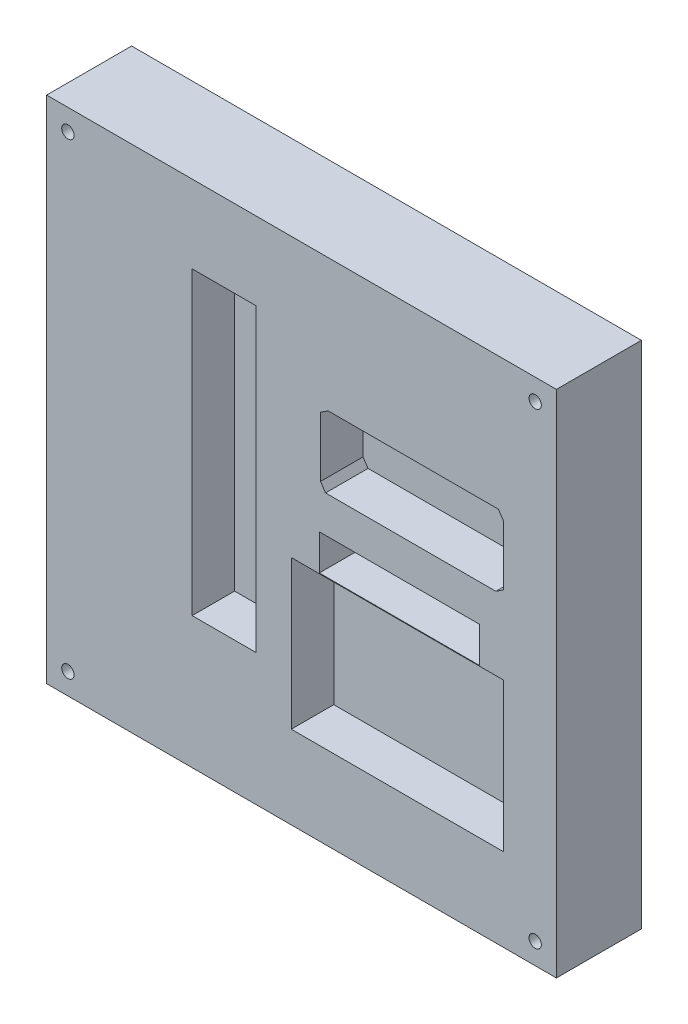
ISO-10303-21;
HEADER;
FILE_DESCRIPTION(('STEP AP214'),'2;1');
FILE_NAME('part.step','',(''),(''),'','','');
FILE_SCHEMA(('AUTOMOTIVE_DESIGN { 1 0 10303 214 1 1 1 1 }'));
ENDSEC;
DATA;
#1=APPLICATION_CONTEXT('core data for automotive mechanical design processes');
#2=APPLICATION_PROTOCOL_DEFINITION('international standard','automotive_design',2000,#1);
#3=PRODUCT_CONTEXT('',#1,'mechanical');
#4=PRODUCT('Part','Part','',(#3));
#5=PRODUCT_RELATED_PRODUCT_CATEGORY('part','',(#4));
#6=PRODUCT_DEFINITION_FORMATION('','',#4);
#7=PRODUCT_DEFINITION_CONTEXT('part definition',#1,'design');
#8=PRODUCT_DEFINITION('design','',#6,#7);
#9=PRODUCT_DEFINITION_SHAPE('','',#8);
#10=(LENGTH_UNIT() NAMED_UNIT(*) SI_UNIT(.MILLI.,.METRE.));
#11=(NAMED_UNIT(*) PLANE_ANGLE_UNIT() SI_UNIT($,.RADIAN.));
#12=(NAMED_UNIT(*) SI_UNIT($,.STERADIAN.) SOLID_ANGLE_UNIT());
#13=UNCERTAINTY_MEASURE_WITH_UNIT(LENGTH_MEASURE(1.E-05),#10,'distance_accuracy_value','');
#14=(GEOMETRIC_REPRESENTATION_CONTEXT(3) GLOBAL_UNCERTAINTY_ASSIGNED_CONTEXT((#13)) GLOBAL_UNIT_ASSIGNED_CONTEXT((#10,
#11,#12)) REPRESENTATION_CONTEXT('',''));
#15=CARTESIAN_POINT('',(0.,0.,0.));
#16=DIRECTION('',(0.,0.,1.));
#17=DIRECTION('',(1.,0.,0.));
#18=AXIS2_PLACEMENT_3D('',#15,#16,#17);
#19=CARTESIAN_POINT('',(-55.,55.,10.));
#20=DIRECTION('',(0.,0.,-1.));
#21=DIRECTION('',(-1.,0.,0.));
#22=AXIS2_PLACEMENT_3D('',#19,#20,#21);
#23=CYLINDRICAL_SURFACE('',#22,1.45);
#24=CARTESIAN_POINT('',(-55.,55.,3.));
#25=DIRECTION('',(0.,0.,1.));
#26=DIRECTION('',(1.,0.,0.));
#27=AXIS2_PLACEMENT_3D('',#24,#25,#26);
#28=CIRCLE('',#27,1.45);
#29=CARTESIAN_POINT('',(-53.55,55.,3.));
#30=VERTEX_POINT('',#29);
#31=EDGE_CURVE('E12',#30,#30,#28,.F.);
#32=ORIENTED_EDGE('',*,*,#31,.T.);
#33=EDGE_LOOP('',(#32));
#34=FACE_BOUND('',#33,.T.);
#35=CARTESIAN_POINT('',(-54.9999999999998,55.0000000000002,20.));
#36=DIRECTION('',(0.,0.,1.));
#37=DIRECTION('',(1.,0.,0.));
#38=AXIS2_PLACEMENT_3D('',#35,#36,#37);
#39=CIRCLE('',#38,1.45);
#40=CARTESIAN_POINT('',(-53.5499999999998,55.0000000000002,20.));
#41=VERTEX_POINT('',#40);
#42=EDGE_CURVE('E414',#41,#41,#39,.T.);
#43=ORIENTED_EDGE('',*,*,#42,.T.);
#44=EDGE_LOOP('',(#43));
#45=FACE_BOUND('',#44,.T.);
#46=ADVANCED_FACE('F193',(#34,#45),#23,.F.);
#47=CARTESIAN_POINT('',(0.,0.,3.));
#48=DIRECTION('',(0.,0.,1.));
#49=DIRECTION('',(1.,0.,0.));
#50=AXIS2_PLACEMENT_3D('',#47,#48,#49);
#51=PLANE('',#50);
#52=ORIENTED_EDGE('',*,*,#31,.F.);
#53=EDGE_LOOP('',(#52));
#54=FACE_BOUND('',#53,.T.);
#55=ADVANCED_FACE('F752',(#54),#51,.T.);
#56=CARTESIAN_POINT('',(0.,0.,10.));
#57=DIRECTION('',(0.,0.,1.));
#58=DIRECTION('',(1.,0.,0.));
#59=AXIS2_PLACEMENT_3D('',#56,#57,#58);
#60=PLANE('',#59);
#61=DIRECTION('',(0.,1.,0.));
#62=VECTOR('',#61,1.);
#63=CARTESIAN_POINT('',(4.18960599997163,0.,10.));
#64=LINE('',#63,#62);
#65=CARTESIAN_POINT('',(4.18960599997163,-5.33102700007435,10.));
#66=VERTEX_POINT('',#65);
#67=CARTESIAN_POINT('',(4.18960599997163,3.05975449992565,10.));
#68=VERTEX_POINT('',#67);
#69=EDGE_CURVE('E568',#66,#68,#64,.T.);
#70=ORIENTED_EDGE('',*,*,#69,.F.);
#71=DIRECTION('',(1.,0.,0.));
#72=VECTOR('',#71,1.);
#73=CARTESIAN_POINT('',(0.,-5.33102700007435,10.));
#74=LINE('',#73,#72);
#75=CARTESIAN_POINT('',(41.9002146158007,-5.33102700007435,10.));
#76=VERTEX_POINT('',#75);
#77=EDGE_CURVE('E398',#66,#76,#74,.T.);
#78=ORIENTED_EDGE('',*,*,#77,.T.);
#79=DIRECTION('',(0.,1.,0.));
#80=VECTOR('',#79,1.);
#81=CARTESIAN_POINT('',(41.9002146158007,0.,10.));
#82=LINE('',#81,#80);
#83=CARTESIAN_POINT('',(41.9002146158007,3.05975449992565,10.));
#84=VERTEX_POINT('',#83);
#85=EDGE_CURVE('E576',#76,#84,#82,.T.);
#86=ORIENTED_EDGE('',*,*,#85,.T.);
#87=DIRECTION('',(1.,0.,0.));
#88=VECTOR('',#87,1.);
#89=CARTESIAN_POINT('',(0.,3.05975449992565,10.));
#90=LINE('',#89,#88);
#91=EDGE_CURVE('E572',#68,#84,#90,.T.);
#92=ORIENTED_EDGE('',*,*,#91,.F.);
#93=EDGE_LOOP('',(#70,#78,#86,#92));
#94=FACE_BOUND('',#93,.T.);
#95=DIRECTION('',(0.,1.,0.));
#96=VECTOR('',#95,1.);
#97=CARTESIAN_POINT('',(-25.7500000000256,0.,10.));
#98=LINE('',#97,#96);
#99=CARTESIAN_POINT('',(-25.7500000000256,-29.0000000000699,10.));
#100=VERTEX_POINT('',#99);
#101=CARTESIAN_POINT('',(-25.7500000000256,41.6995702207587,10.));
#102=VERTEX_POINT('',#101);
#103=EDGE_CURVE('E552',#100,#102,#98,.T.);
#104=ORIENTED_EDGE('',*,*,#103,.F.);
#105=DIRECTION('',(1.,0.,0.));
#106=VECTOR('',#105,1.);
#107=CARTESIAN_POINT('',(0.,-29.00000000007,10.));
#108=LINE('',#107,#106);
#109=CARTESIAN_POINT('',(-10.7500000000256,-29.0000000000699,10.));
#110=VERTEX_POINT('',#109);
#111=EDGE_CURVE('E564',#100,#110,#108,.T.);
#112=ORIENTED_EDGE('',*,*,#111,.T.);
#113=DIRECTION('',(0.,1.,0.));
#114=VECTOR('',#113,1.);
#115=CARTESIAN_POINT('',(-10.7500000000256,0.,10.));
#116=LINE('',#115,#114);
#117=CARTESIAN_POINT('',(-10.7500000000256,41.6995702207587,10.));
#118=VERTEX_POINT('',#117);
#119=EDGE_CURVE('E560',#110,#118,#116,.T.);
#120=ORIENTED_EDGE('',*,*,#119,.T.);
#121=DIRECTION('',(1.,0.,0.));
#122=VECTOR('',#121,1.);
#123=CARTESIAN_POINT('',(0.,41.6995702207587,10.));
#124=LINE('',#123,#122);
#125=EDGE_CURVE('E556',#102,#118,#124,.T.);
#126=ORIENTED_EDGE('',*,*,#125,.F.);
#127=EDGE_LOOP('',(#104,#112,#120,#126));
#128=FACE_BOUND('',#127,.T.);
#129=DIRECTION('',(0.,1.,0.));
#130=VECTOR('',#129,1.);
#131=CARTESIAN_POINT('',(47.5899999999712,-1.69828437027469E-13,10.));
#132=LINE('',#131,#130);
#133=CARTESIAN_POINT('',(47.589999999971,-40.4826051319353,10.));
#134=VERTEX_POINT('',#133);
#135=CARTESIAN_POINT('',(47.5899999999711,-5.48260513193532,10.));
#136=VERTEX_POINT('',#135);
#137=EDGE_CURVE('E536',#134,#136,#132,.T.);
#138=ORIENTED_EDGE('',*,*,#137,.T.);
#139=DIRECTION('',(1.,0.,0.));
#140=VECTOR('',#139,1.);
#141=CARTESIAN_POINT('',(0.,-5.48260513193516,10.));
#142=LINE('',#141,#140);
#143=CARTESIAN_POINT('',(-2.41000000002885,-5.48260513193515,10.));
#144=VERTEX_POINT('',#143);
#145=EDGE_CURVE('E548',#144,#136,#142,.T.);
#146=ORIENTED_EDGE('',*,*,#145,.F.);
#147=DIRECTION('',(0.,1.,0.));
#148=VECTOR('',#147,1.);
#149=CARTESIAN_POINT('',(-2.41000000002883,0.,10.));
#150=LINE('',#149,#148);
#151=CARTESIAN_POINT('',(-2.41000000002897,-40.4826051319352,10.));
#152=VERTEX_POINT('',#151);
#153=EDGE_CURVE('E544',#152,#144,#150,.T.);
#154=ORIENTED_EDGE('',*,*,#153,.F.);
#155=DIRECTION('',(1.,0.,0.));
#156=VECTOR('',#155,1.);
#157=CARTESIAN_POINT('',(-1.4607034102142E-13,-40.4826051319352,10.));
#158=LINE('',#157,#156);
#159=EDGE_CURVE('E540',#152,#134,#158,.T.);
#160=ORIENTED_EDGE('',*,*,#159,.T.);
#161=EDGE_LOOP('',(#138,#146,#154,#160));
#162=FACE_BOUND('',#161,.T.);
#163=DIRECTION('',(-0.999999999198216,4.00445657316263E-05,0.));
#164=VECTOR('',#163,1.);
#165=CARTESIAN_POINT('',(0.00115129248890918,28.7502802677874,10.));
#166=LINE('',#165,#164);
#167=CARTESIAN_POINT('',(46.3440039648104,28.7484244883759,10.));
#168=VERTEX_POINT('',#167);
#169=CARTESIAN_POINT('',(6.24170963324261,28.7500303673385,10.));
#170=VERTEX_POINT('',#169);
#171=EDGE_CURVE('E504',#168,#170,#166,.T.);
#172=ORIENTED_EDGE('',*,*,#171,.T.);
#173=DIRECTION('',(-0.831482185307425,-0.555551415727103,0.));
#174=VECTOR('',#173,1.);
#175=CARTESIAN_POINT('',(-11.3541084221618,16.9934566195292,10.));
#176=LINE('',#175,#174);
#177=CARTESIAN_POINT('',(4.48169137538211,27.574081378728,10.));
#178=VERTEX_POINT('',#177);
#179=EDGE_CURVE('E532',#170,#178,#176,.T.);
#180=ORIENTED_EDGE('',*,*,#179,.T.);
#181=DIRECTION('',(-0.000126752485357717,-0.999999991966904,0.));
#182=VECTOR('',#181,1.);
#183=CARTESIAN_POINT('',(4.47819622006026,-0.00056762250537194,10.));
#184=LINE('',#183,#182);
#185=CARTESIAN_POINT('',(4.47990387717387,13.4718080479059,10.));
#186=VERTEX_POINT('',#185);
#187=EDGE_CURVE('E528',#178,#186,#184,.T.);
#188=ORIENTED_EDGE('',*,*,#187,.T.);
#189=DIRECTION('',(0.555551415727123,-0.831482185307412,0.));
#190=VECTOR('',#189,1.);
#191=CARTESIAN_POINT('',(9.32028528256066,6.22731042853659,10.));
#192=LINE('',#191,#190);
#193=CARTESIAN_POINT('',(5.65599603513327,11.7115755114752,10.));
#194=VERTEX_POINT('',#193);
#195=EDGE_CURVE('E524',#186,#194,#192,.T.);
#196=ORIENTED_EDGE('',*,*,#195,.T.);
#197=DIRECTION('',(0.999999999198216,-4.00445657317132E-05,0.));
#198=VECTOR('',#197,1.);
#199=CARTESIAN_POINT('',(0.000468994024785145,11.7118019845997,10.));
#200=LINE('',#199,#198);
#201=CARTESIAN_POINT('',(45.7582903667007,11.7099696325126,10.));
#202=VERTEX_POINT('',#201);
#203=EDGE_CURVE('E520',#194,#202,#200,.T.);
#204=ORIENTED_EDGE('',*,*,#203,.T.);
#205=DIRECTION('',(0.83148218530746,0.555551415727051,0.));
#206=VECTOR('',#205,1.);
#207=CARTESIAN_POINT('',(8.71351943269496,-13.0413423033663,10.));
#208=LINE('',#207,#206);
#209=CARTESIAN_POINT('',(47.5183086245613,12.885918621123,10.));
#210=VERTEX_POINT('',#209);
#211=EDGE_CURVE('E516',#202,#210,#208,.T.);
#212=ORIENTED_EDGE('',*,*,#211,.T.);
#213=DIRECTION('',(0.000126752485356734,0.999999991966904,0.));
#214=VECTOR('',#213,1.);
#215=CARTESIAN_POINT('',(47.5166745389248,-0.00602285664207795,10.));
#216=LINE('',#215,#214);
#217=CARTESIAN_POINT('',(47.5200961227695,26.9881919519451,10.));
#218=VERTEX_POINT('',#217);
#219=EDGE_CURVE('E512',#210,#218,#216,.T.);
#220=ORIENTED_EDGE('',*,*,#219,.T.);
#221=DIRECTION('',(-0.55555141572701,0.831482185307488,0.));
#222=VECTOR('',#221,1.);
#223=CARTESIAN_POINT('',(45.3203037068509,30.2805752551489,10.));
#224=LINE('',#223,#222);
#225=EDGE_CURVE('E508',#218,#168,#224,.T.);
#226=ORIENTED_EDGE('',*,*,#225,.T.);
#227=EDGE_LOOP('',(#172,#180,#188,#196,#204,#212,#220,#226));
#228=FACE_BOUND('',#227,.T.);
#229=CARTESIAN_POINT('',(46.,-46.,10.));
#230=DIRECTION('',(0.,0.,1.));
#231=DIRECTION('',(1.,0.,0.));
#232=AXIS2_PLACEMENT_3D('',#229,#230,#231);
#233=CIRCLE('',#232,1.45);
#234=CARTESIAN_POINT('',(47.45,-46.,10.));
#235=VERTEX_POINT('',#234);
#236=EDGE_CURVE('E707',#235,#235,#233,.T.);
#237=ORIENTED_EDGE('',*,*,#236,.T.);
#238=EDGE_LOOP('',(#237));
#239=FACE_BOUND('',#238,.T.);
#240=CARTESIAN_POINT('',(-1.5,42.5,10.));
#241=DIRECTION('',(0.,0.,1.));
#242=DIRECTION('',(1.,0.,0.));
#243=AXIS2_PLACEMENT_3D('',#240,#241,#242);
#244=CIRCLE('',#243,1.45);
#245=CARTESIAN_POINT('',(-0.0499999999999999,42.5,10.));
#246=VERTEX_POINT('',#245);
#247=EDGE_CURVE('E699',#246,#246,#244,.T.);
#248=ORIENTED_EDGE('',*,*,#247,.T.);
#249=EDGE_LOOP('',(#248));
#250=FACE_BOUND('',#249,.T.);
#251=DIRECTION('',(-1.,0.,0.));
#252=VECTOR('',#251,1.);
#253=CARTESIAN_POINT('',(50.,50.,10.));
#254=LINE('',#253,#252);
#255=CARTESIAN_POINT('',(50.,50.,10.));
#256=VERTEX_POINT('',#255);
#257=CARTESIAN_POINT('',(-50.,50.,10.));
#258=VERTEX_POINT('',#257);
#259=EDGE_CURVE('E667',#256,#258,#254,.T.);
#260=ORIENTED_EDGE('',*,*,#259,.F.);
#261=DIRECTION('',(0.,1.,0.));
#262=VECTOR('',#261,1.);
#263=CARTESIAN_POINT('',(50.,-50.,10.));
#264=LINE('',#263,#262);
#265=CARTESIAN_POINT('',(50.,-50.,10.));
#266=VERTEX_POINT('',#265);
#267=EDGE_CURVE('E671',#266,#256,#264,.T.);
#268=ORIENTED_EDGE('',*,*,#267,.F.);
#269=DIRECTION('',(-1.,0.,0.));
#270=VECTOR('',#269,1.);
#271=CARTESIAN_POINT('',(50.,-50.,10.));
#272=LINE('',#271,#270);
#273=CARTESIAN_POINT('',(-50.,-50.,10.));
#274=VERTEX_POINT('',#273);
#275=EDGE_CURVE('E659',#266,#274,#272,.T.);
#276=ORIENTED_EDGE('',*,*,#275,.T.);
#277=DIRECTION('',(0.,1.,0.));
#278=VECTOR('',#277,1.);
#279=CARTESIAN_POINT('',(-50.,-50.,10.));
#280=LINE('',#279,#278);
#281=EDGE_CURVE('E663',#274,#258,#280,.T.);
#282=ORIENTED_EDGE('',*,*,#281,.T.);
#283=EDGE_LOOP('',(#260,#268,#276,#282));
#284=FACE_BOUND('',#283,.T.);
#285=ADVANCED_FACE('F760',(#94,#128,#162,#228,#239,#250,#284),#60,.F.);
#286=CARTESIAN_POINT('',(4.18960599997163,0.,20.));
#287=DIRECTION('',(-1.,0.,0.));
#288=DIRECTION('',(0.,0.,1.));
#289=AXIS2_PLACEMENT_3D('',#286,#287,#288);
#290=PLANE('',#289);
#291=ORIENTED_EDGE('',*,*,#69,.T.);
#292=DIRECTION('',(0.,0.,-1.));
#293=VECTOR('',#292,1.);
#294=CARTESIAN_POINT('',(4.18960599997163,3.05975449992565,20.));
#295=LINE('',#294,#293);
#296=CARTESIAN_POINT('',(4.18960599997163,3.05975449992565,20.));
#297=VERTEX_POINT('',#296);
#298=EDGE_CURVE('E593',#297,#68,#295,.T.);
#299=ORIENTED_EDGE('',*,*,#298,.F.);
#300=DIRECTION('',(0.,1.,0.));
#301=VECTOR('',#300,1.);
#302=CARTESIAN_POINT('',(4.18960599997163,0.,20.));
#303=LINE('',#302,#301);
#304=CARTESIAN_POINT('',(4.18960599997163,-5.33102700007435,20.));
#305=VERTEX_POINT('',#304);
#306=EDGE_CURVE('E488',#305,#297,#303,.T.);
#307=ORIENTED_EDGE('',*,*,#306,.F.);
#308=DIRECTION('',(0.,0.,-1.));
#309=VECTOR('',#308,1.);
#310=CARTESIAN_POINT('',(4.18960599997163,-5.33102700007435,20.));
#311=LINE('',#310,#309);
#312=EDGE_CURVE('E583',#305,#66,#311,.T.);
#313=ORIENTED_EDGE('',*,*,#312,.T.);
#314=EDGE_LOOP('',(#291,#299,#307,#313));
#315=FACE_BOUND('',#314,.T.);
#316=ADVANCED_FACE('F829',(#315),#290,.F.);
#317=CARTESIAN_POINT('',(0.,3.05975449992565,20.));
#318=DIRECTION('',(0.,1.,0.));
#319=DIRECTION('',(0.,0.,1.));
#320=AXIS2_PLACEMENT_3D('',#317,#318,#319);
#321=PLANE('',#320);
#322=ORIENTED_EDGE('',*,*,#91,.T.);
#323=DIRECTION('',(0.,0.,-1.));
#324=VECTOR('',#323,1.);
#325=CARTESIAN_POINT('',(41.9002146158007,3.05975449992565,20.));
#326=LINE('',#325,#324);
#327=CARTESIAN_POINT('',(41.9002146158007,3.05975449992565,20.));
#328=VERTEX_POINT('',#327);
#329=EDGE_CURVE('E590',#328,#84,#326,.T.);
#330=ORIENTED_EDGE('',*,*,#329,.F.);
#331=DIRECTION('',(1.,0.,0.));
#332=VECTOR('',#331,1.);
#333=CARTESIAN_POINT('',(0.,3.05975449992565,20.));
#334=LINE('',#333,#332);
#335=EDGE_CURVE('E492',#297,#328,#334,.T.);
#336=ORIENTED_EDGE('',*,*,#335,.F.);
#337=ORIENTED_EDGE('',*,*,#298,.T.);
#338=EDGE_LOOP('',(#322,#330,#336,#337));
#339=FACE_BOUND('',#338,.T.);
#340=ADVANCED_FACE('F832',(#339),#321,.F.);
#341=CARTESIAN_POINT('',(41.9002146158007,0.,20.));
#342=DIRECTION('',(-1.,0.,0.));
#343=DIRECTION('',(0.,0.,1.));
#344=AXIS2_PLACEMENT_3D('',#341,#342,#343);
#345=PLANE('',#344);
#346=ORIENTED_EDGE('',*,*,#85,.F.);
#347=DIRECTION('',(0.,0.,-1.));
#348=VECTOR('',#347,1.);
#349=CARTESIAN_POINT('',(41.9002146158007,-5.33102700007435,20.));
#350=LINE('',#349,#348);
#351=CARTESIAN_POINT('',(41.9002146158007,-5.33102700007435,20.));
#352=VERTEX_POINT('',#351);
#353=EDGE_CURVE('E586',#352,#76,#350,.T.);
#354=ORIENTED_EDGE('',*,*,#353,.F.);
#355=DIRECTION('',(0.,1.,0.));
#356=VECTOR('',#355,1.);
#357=CARTESIAN_POINT('',(41.9002146158007,0.,20.));
#358=LINE('',#357,#356);
#359=EDGE_CURVE('E495',#352,#328,#358,.T.);
#360=ORIENTED_EDGE('',*,*,#359,.T.);
#361=ORIENTED_EDGE('',*,*,#329,.T.);
#362=EDGE_LOOP('',(#346,#354,#360,#361));
#363=FACE_BOUND('',#362,.T.);
#364=ADVANCED_FACE('F835',(#363),#345,.T.);
#365=CARTESIAN_POINT('',(-25.7500000000256,0.,20.));
#366=DIRECTION('',(-1.,0.,0.));
#367=DIRECTION('',(0.,0.,1.));
#368=AXIS2_PLACEMENT_3D('',#365,#366,#367);
#369=PLANE('',#368);
#370=ORIENTED_EDGE('',*,*,#103,.T.);
#371=DIRECTION('',(0.,0.,-1.));
#372=VECTOR('',#371,1.);
#373=CARTESIAN_POINT('',(-25.7500000000256,41.6995702207587,20.));
#374=LINE('',#373,#372);
#375=CARTESIAN_POINT('',(-25.7500000000256,41.6995702207587,20.));
#376=VERTEX_POINT('',#375);
#377=EDGE_CURVE('E587',#376,#102,#374,.T.);
#378=ORIENTED_EDGE('',*,*,#377,.F.);
#379=DIRECTION('',(0.,1.,0.));
#380=VECTOR('',#379,1.);
#381=CARTESIAN_POINT('',(-25.7500000000256,0.,20.));
#382=LINE('',#381,#380);
#383=CARTESIAN_POINT('',(-25.7500000000256,-29.0000000000699,20.));
#384=VERTEX_POINT('',#383);
#385=EDGE_CURVE('E473',#384,#376,#382,.T.);
#386=ORIENTED_EDGE('',*,*,#385,.F.);
#387=DIRECTION('',(0.,0.,-1.));
#388=VECTOR('',#387,1.);
#389=CARTESIAN_POINT('',(-25.7500000000256,-29.0000000000699,20.));
#390=LINE('',#389,#388);
#391=EDGE_CURVE('E598',#384,#100,#390,.T.);
#392=ORIENTED_EDGE('',*,*,#391,.T.);
#393=EDGE_LOOP('',(#370,#378,#386,#392));
#394=FACE_BOUND('',#393,.T.);
#395=ADVANCED_FACE('F925',(#394),#369,.F.);
#396=CARTESIAN_POINT('',(0.,41.6995702207587,20.));
#397=DIRECTION('',(0.,1.,0.));
#398=DIRECTION('',(0.,0.,1.));
#399=AXIS2_PLACEMENT_3D('',#396,#397,#398);
#400=PLANE('',#399);
#401=ORIENTED_EDGE('',*,*,#125,.T.);
#402=DIRECTION('',(0.,0.,-1.));
#403=VECTOR('',#402,1.);
#404=CARTESIAN_POINT('',(-10.7500000000256,41.6995702207587,20.));
#405=LINE('',#404,#403);
#406=CARTESIAN_POINT('',(-10.7500000000256,41.6995702207587,20.));
#407=VERTEX_POINT('',#406);
#408=EDGE_CURVE('E605',#407,#118,#405,.T.);
#409=ORIENTED_EDGE('',*,*,#408,.F.);
#410=DIRECTION('',(1.,0.,0.));
#411=VECTOR('',#410,1.);
#412=CARTESIAN_POINT('',(0.,41.6995702207587,20.));
#413=LINE('',#412,#411);
#414=EDGE_CURVE('E477',#376,#407,#413,.T.);
#415=ORIENTED_EDGE('',*,*,#414,.F.);
#416=ORIENTED_EDGE('',*,*,#377,.T.);
#417=EDGE_LOOP('',(#401,#409,#415,#416));
#418=FACE_BOUND('',#417,.T.);
#419=ADVANCED_FACE('F928',(#418),#400,.F.);
#420=CARTESIAN_POINT('',(-10.7500000000256,0.,20.));
#421=DIRECTION('',(-1.,0.,0.));
#422=DIRECTION('',(0.,0.,1.));
#423=AXIS2_PLACEMENT_3D('',#420,#421,#422);
#424=PLANE('',#423);
#425=ORIENTED_EDGE('',*,*,#119,.F.);
#426=DIRECTION('',(0.,0.,-1.));
#427=VECTOR('',#426,1.);
#428=CARTESIAN_POINT('',(-10.7500000000256,-29.0000000000699,20.));
#429=LINE('',#428,#427);
#430=CARTESIAN_POINT('',(-10.7500000000256,-29.0000000000699,20.));
#431=VERTEX_POINT('',#430);
#432=EDGE_CURVE('E601',#431,#110,#429,.T.);
#433=ORIENTED_EDGE('',*,*,#432,.F.);
#434=DIRECTION('',(0.,1.,0.));
#435=VECTOR('',#434,1.);
#436=CARTESIAN_POINT('',(-10.7500000000256,0.,20.));
#437=LINE('',#436,#435);
#438=EDGE_CURVE('E480',#431,#407,#437,.T.);
#439=ORIENTED_EDGE('',*,*,#438,.T.);
#440=ORIENTED_EDGE('',*,*,#408,.T.);
#441=EDGE_LOOP('',(#425,#433,#439,#440));
#442=FACE_BOUND('',#441,.T.);
#443=ADVANCED_FACE('F914',(#442),#424,.T.);
#444=CARTESIAN_POINT('',(47.5899999999712,-1.69828437027469E-13,20.));
#445=DIRECTION('',(-1.,0.,0.));
#446=DIRECTION('',(0.,-1.,0.));
#447=AXIS2_PLACEMENT_3D('',#444,#445,#446);
#448=PLANE('',#447);
#449=ORIENTED_EDGE('',*,*,#137,.F.);
#450=DIRECTION('',(0.,0.,-1.));
#451=VECTOR('',#450,1.);
#452=CARTESIAN_POINT('',(47.589999999971,-40.4826051319353,20.));
#453=LINE('',#452,#451);
#454=CARTESIAN_POINT('',(47.589999999971,-40.4826051319353,20.));
#455=VERTEX_POINT('',#454);
#456=EDGE_CURVE('E602',#455,#134,#453,.T.);
#457=ORIENTED_EDGE('',*,*,#456,.F.);
#458=DIRECTION('',(0.,1.,0.));
#459=VECTOR('',#458,1.);
#460=CARTESIAN_POINT('',(47.5899999999712,-1.69828437027469E-13,20.));
#461=LINE('',#460,#459);
#462=CARTESIAN_POINT('',(47.5899999999711,-5.48260513193532,20.));
#463=VERTEX_POINT('',#462);
#464=EDGE_CURVE('E458',#455,#463,#461,.T.);
#465=ORIENTED_EDGE('',*,*,#464,.T.);
#466=DIRECTION('',(0.,0.,-1.));
#467=VECTOR('',#466,1.);
#468=CARTESIAN_POINT('',(47.5899999999711,-5.48260513193532,20.));
#469=LINE('',#468,#467);
#470=EDGE_CURVE('E611',#463,#136,#469,.T.);
#471=ORIENTED_EDGE('',*,*,#470,.T.);
#472=EDGE_LOOP('',(#449,#457,#465,#471));
#473=FACE_BOUND('',#472,.T.);
#474=ADVANCED_FACE('F910',(#473),#448,.T.);
#475=CARTESIAN_POINT('',(-1.4607034102142E-13,-40.4826051319352,20.));
#476=DIRECTION('',(0.,1.,0.));
#477=DIRECTION('',(-1.,0.,0.));
#478=AXIS2_PLACEMENT_3D('',#475,#476,#477);
#479=PLANE('',#478);
#480=ORIENTED_EDGE('',*,*,#159,.F.);
#481=DIRECTION('',(0.,0.,-1.));
#482=VECTOR('',#481,1.);
#483=CARTESIAN_POINT('',(-2.41000000002897,-40.4826051319352,20.));
#484=LINE('',#483,#482);
#485=CARTESIAN_POINT('',(-2.41000000002897,-40.4826051319352,20.));
#486=VERTEX_POINT('',#485);
#487=EDGE_CURVE('E619',#486,#152,#484,.T.);
#488=ORIENTED_EDGE('',*,*,#487,.F.);
#489=DIRECTION('',(1.,0.,0.));
#490=VECTOR('',#489,1.);
#491=CARTESIAN_POINT('',(-1.4607034102142E-13,-40.4826051319352,20.));
#492=LINE('',#491,#490);
#493=EDGE_CURVE('E462',#486,#455,#492,.T.);
#494=ORIENTED_EDGE('',*,*,#493,.T.);
#495=ORIENTED_EDGE('',*,*,#456,.T.);
#496=EDGE_LOOP('',(#480,#488,#494,#495));
#497=FACE_BOUND('',#496,.T.);
#498=ADVANCED_FACE('F913',(#497),#479,.T.);
#499=CARTESIAN_POINT('',(-2.41000000002883,0.,20.));
#500=DIRECTION('',(-1.,0.,0.));
#501=DIRECTION('',(0.,-1.,0.));
#502=AXIS2_PLACEMENT_3D('',#499,#500,#501);
#503=PLANE('',#502);
#504=ORIENTED_EDGE('',*,*,#153,.T.);
#505=DIRECTION('',(0.,0.,-1.));
#506=VECTOR('',#505,1.);
#507=CARTESIAN_POINT('',(-2.41000000002885,-5.48260513193515,20.));
#508=LINE('',#507,#506);
#509=CARTESIAN_POINT('',(-2.41000000002885,-5.48260513193515,20.));
#510=VERTEX_POINT('',#509);
#511=EDGE_CURVE('E614',#510,#144,#508,.T.);
#512=ORIENTED_EDGE('',*,*,#511,.F.);
#513=DIRECTION('',(0.,1.,0.));
#514=VECTOR('',#513,1.);
#515=CARTESIAN_POINT('',(-2.41000000002883,0.,20.));
#516=LINE('',#515,#514);
#517=EDGE_CURVE('E466',#486,#510,#516,.T.);
#518=ORIENTED_EDGE('',*,*,#517,.F.);
#519=ORIENTED_EDGE('',*,*,#487,.T.);
#520=EDGE_LOOP('',(#504,#512,#518,#519));
#521=FACE_BOUND('',#520,.T.);
#522=ADVANCED_FACE('F879',(#521),#503,.F.);
#523=CARTESIAN_POINT('',(0.00115129248890918,28.7502802677874,20.));
#524=DIRECTION('',(-4.00445657316263E-05,-0.999999999198216,0.));
#525=DIRECTION('',(0.999999999198216,-4.00445657316263E-05,0.));
#526=AXIS2_PLACEMENT_3D('',#523,#524,#525);
#527=PLANE('',#526);
#528=ORIENTED_EDGE('',*,*,#171,.F.);
#529=DIRECTION('',(0.,0.,-1.));
#530=VECTOR('',#529,1.);
#531=CARTESIAN_POINT('',(46.3440039648104,28.7484244883759,20.));
#532=LINE('',#531,#530);
#533=CARTESIAN_POINT('',(46.3440039648104,28.7484244883759,20.));
#534=VERTEX_POINT('',#533);
#535=EDGE_CURVE('E615',#534,#168,#532,.T.);
#536=ORIENTED_EDGE('',*,*,#535,.F.);
#537=DIRECTION('',(-0.999999999198216,4.00445657316263E-05,0.));
#538=VECTOR('',#537,1.);
#539=CARTESIAN_POINT('',(0.00115129248890918,28.7502802677874,20.));
#540=LINE('',#539,#538);
#541=CARTESIAN_POINT('',(6.24170963324261,28.7500303673385,20.));
#542=VERTEX_POINT('',#541);
#543=EDGE_CURVE('E426',#534,#542,#540,.T.);
#544=ORIENTED_EDGE('',*,*,#543,.T.);
#545=DIRECTION('',(0.,0.,-1.));
#546=VECTOR('',#545,1.);
#547=CARTESIAN_POINT('',(6.24170963324261,28.7500303673385,20.));
#548=LINE('',#547,#546);
#549=EDGE_CURVE('E503',#542,#170,#548,.T.);
#550=ORIENTED_EDGE('',*,*,#549,.T.);
#551=EDGE_LOOP('',(#528,#536,#544,#550));
#552=FACE_BOUND('',#551,.T.);
#553=ADVANCED_FACE('F875',(#552),#527,.T.);
#554=CARTESIAN_POINT('',(45.3203037068509,30.2805752551489,20.));
#555=DIRECTION('',(-0.831482185307488,-0.55555141572701,0.));
#556=DIRECTION('',(0.55555141572701,-0.831482185307488,0.));
#557=AXIS2_PLACEMENT_3D('',#554,#555,#556);
#558=PLANE('',#557);
#559=ORIENTED_EDGE('',*,*,#225,.F.);
#560=DIRECTION('',(0.,0.,-1.));
#561=VECTOR('',#560,1.);
#562=CARTESIAN_POINT('',(47.5200961227695,26.9881919519451,20.));
#563=LINE('',#562,#561);
#564=CARTESIAN_POINT('',(47.5200961227695,26.9881919519451,20.));
#565=VERTEX_POINT('',#564);
#566=EDGE_CURVE('E641',#565,#218,#563,.T.);
#567=ORIENTED_EDGE('',*,*,#566,.F.);
#568=DIRECTION('',(-0.55555141572701,0.831482185307488,0.));
#569=VECTOR('',#568,1.);
#570=CARTESIAN_POINT('',(45.3203037068509,30.2805752551489,20.));
#571=LINE('',#570,#569);
#572=EDGE_CURVE('E430',#565,#534,#571,.T.);
#573=ORIENTED_EDGE('',*,*,#572,.T.);
#574=ORIENTED_EDGE('',*,*,#535,.T.);
#575=EDGE_LOOP('',(#559,#567,#573,#574));
#576=FACE_BOUND('',#575,.T.);
#577=ADVANCED_FACE('F878',(#576),#558,.T.);
#578=CARTESIAN_POINT('',(47.5166745389248,-0.00602285664207795,20.));
#579=DIRECTION('',(-0.999999991966904,0.000126752485356734,0.));
#580=DIRECTION('',(-0.000126752485356734,-0.999999991966904,0.));
#581=AXIS2_PLACEMENT_3D('',#578,#579,#580);
#582=PLANE('',#581);
#583=ORIENTED_EDGE('',*,*,#219,.F.);
#584=DIRECTION('',(0.,0.,-1.));
#585=VECTOR('',#584,1.);
#586=CARTESIAN_POINT('',(47.5183086245613,12.885918621123,20.));
#587=LINE('',#586,#585);
#588=CARTESIAN_POINT('',(47.5183086245613,12.885918621123,20.));
#589=VERTEX_POINT('',#588);
#590=EDGE_CURVE('E638',#589,#210,#587,.T.);
#591=ORIENTED_EDGE('',*,*,#590,.F.);
#592=DIRECTION('',(0.000126752485356734,0.999999991966904,0.));
#593=VECTOR('',#592,1.);
#594=CARTESIAN_POINT('',(47.5166745389248,-0.00602285664207795,20.));
#595=LINE('',#594,#593);
#596=EDGE_CURVE('E434',#589,#565,#595,.T.);
#597=ORIENTED_EDGE('',*,*,#596,.T.);
#598=ORIENTED_EDGE('',*,*,#566,.T.);
#599=EDGE_LOOP('',(#583,#591,#597,#598));
#600=FACE_BOUND('',#599,.T.);
#601=ADVANCED_FACE('F883',(#600),#582,.T.);
#602=CARTESIAN_POINT('',(8.71351943269496,-13.0413423033663,20.));
#603=DIRECTION('',(-0.555551415727051,0.83148218530746,0.));
#604=DIRECTION('',(-0.83148218530746,-0.555551415727051,0.));
#605=AXIS2_PLACEMENT_3D('',#602,#603,#604);
#606=PLANE('',#605);
#607=ORIENTED_EDGE('',*,*,#211,.F.);
#608=DIRECTION('',(0.,0.,-1.));
#609=VECTOR('',#608,1.);
#610=CARTESIAN_POINT('',(45.7582903667007,11.7099696325126,20.));
#611=LINE('',#610,#609);
#612=CARTESIAN_POINT('',(45.7582903667007,11.7099696325126,20.));
#613=VERTEX_POINT('',#612);
#614=EDGE_CURVE('E635',#613,#202,#611,.T.);
#615=ORIENTED_EDGE('',*,*,#614,.F.);
#616=DIRECTION('',(0.83148218530746,0.555551415727051,0.));
#617=VECTOR('',#616,1.);
#618=CARTESIAN_POINT('',(8.71351943269496,-13.0413423033663,20.));
#619=LINE('',#618,#617);
#620=EDGE_CURVE('E438',#613,#589,#619,.T.);
#621=ORIENTED_EDGE('',*,*,#620,.T.);
#622=ORIENTED_EDGE('',*,*,#590,.T.);
#623=EDGE_LOOP('',(#607,#615,#621,#622));
#624=FACE_BOUND('',#623,.T.);
#625=ADVANCED_FACE('F887',(#624),#606,.T.);
#626=CARTESIAN_POINT('',(0.000468994024785145,11.7118019845997,20.));
#627=DIRECTION('',(4.00445657317132E-05,0.999999999198216,0.));
#628=DIRECTION('',(-0.999999999198216,4.00445657317132E-05,0.));
#629=AXIS2_PLACEMENT_3D('',#626,#627,#628);
#630=PLANE('',#629);
#631=ORIENTED_EDGE('',*,*,#203,.F.);
#632=DIRECTION('',(0.,0.,-1.));
#633=VECTOR('',#632,1.);
#634=CARTESIAN_POINT('',(5.65599603513327,11.7115755114752,20.));
#635=LINE('',#634,#633);
#636=CARTESIAN_POINT('',(5.65599603513327,11.7115755114752,20.));
#637=VERTEX_POINT('',#636);
#638=EDGE_CURVE('E632',#637,#194,#635,.T.);
#639=ORIENTED_EDGE('',*,*,#638,.F.);
#640=DIRECTION('',(0.999999999198216,-4.00445657317132E-05,0.));
#641=VECTOR('',#640,1.);
#642=CARTESIAN_POINT('',(0.000468994024785145,11.7118019845997,20.));
#643=LINE('',#642,#641);
#644=EDGE_CURVE('E442',#637,#613,#643,.T.);
#645=ORIENTED_EDGE('',*,*,#644,.T.);
#646=ORIENTED_EDGE('',*,*,#614,.T.);
#647=EDGE_LOOP('',(#631,#639,#645,#646));
#648=FACE_BOUND('',#647,.T.);
#649=ADVANCED_FACE('F891',(#648),#630,.T.);
#650=CARTESIAN_POINT('',(9.32028528256066,6.22731042853659,20.));
#651=DIRECTION('',(0.831482185307412,0.555551415727123,0.));
#652=DIRECTION('',(-0.555551415727123,0.831482185307412,0.));
#653=AXIS2_PLACEMENT_3D('',#650,#651,#652);
#654=PLANE('',#653);
#655=ORIENTED_EDGE('',*,*,#195,.F.);
#656=DIRECTION('',(0.,0.,-1.));
#657=VECTOR('',#656,1.);
#658=CARTESIAN_POINT('',(4.47990387717387,13.4718080479059,20.));
#659=LINE('',#658,#657);
#660=CARTESIAN_POINT('',(4.47990387717387,13.4718080479059,20.));
#661=VERTEX_POINT('',#660);
#662=EDGE_CURVE('E629',#661,#186,#659,.T.);
#663=ORIENTED_EDGE('',*,*,#662,.F.);
#664=DIRECTION('',(0.555551415727123,-0.831482185307412,0.));
#665=VECTOR('',#664,1.);
#666=CARTESIAN_POINT('',(9.32028528256066,6.22731042853659,20.));
#667=LINE('',#666,#665);
#668=EDGE_CURVE('E446',#661,#637,#667,.T.);
#669=ORIENTED_EDGE('',*,*,#668,.T.);
#670=ORIENTED_EDGE('',*,*,#638,.T.);
#671=EDGE_LOOP('',(#655,#663,#669,#670));
#672=FACE_BOUND('',#671,.T.);
#673=ADVANCED_FACE('F895',(#672),#654,.T.);
#674=CARTESIAN_POINT('',(4.47819622006026,-0.00056762250537194,20.));
#675=DIRECTION('',(0.999999991966904,-0.000126752485357717,0.));
#676=DIRECTION('',(0.000126752485357717,0.999999991966904,0.));
#677=AXIS2_PLACEMENT_3D('',#674,#675,#676);
#678=PLANE('',#677);
#679=ORIENTED_EDGE('',*,*,#187,.F.);
#680=DIRECTION('',(0.,0.,-1.));
#681=VECTOR('',#680,1.);
#682=CARTESIAN_POINT('',(4.48169137538211,27.574081378728,20.));
#683=LINE('',#682,#681);
#684=CARTESIAN_POINT('',(4.48169137538211,27.574081378728,20.));
#685=VERTEX_POINT('',#684);
#686=EDGE_CURVE('E626',#685,#178,#683,.T.);
#687=ORIENTED_EDGE('',*,*,#686,.F.);
#688=DIRECTION('',(-0.000126752485357717,-0.999999991966904,0.));
#689=VECTOR('',#688,1.);
#690=CARTESIAN_POINT('',(4.47819622006026,-0.00056762250537194,20.));
#691=LINE('',#690,#689);
#692=EDGE_CURVE('E450',#685,#661,#691,.T.);
#693=ORIENTED_EDGE('',*,*,#692,.T.);
#694=ORIENTED_EDGE('',*,*,#662,.T.);
#695=EDGE_LOOP('',(#679,#687,#693,#694));
#696=FACE_BOUND('',#695,.T.);
#697=ADVANCED_FACE('F899',(#696),#678,.T.);
#698=CARTESIAN_POINT('',(0.,-29.00000000007,20.));
#699=DIRECTION('',(0.,1.,0.));
#700=DIRECTION('',(-1.,0.,0.));
#701=AXIS2_PLACEMENT_3D('',#698,#699,#700);
#702=PLANE('',#701);
#703=ORIENTED_EDGE('',*,*,#111,.F.);
#704=ORIENTED_EDGE('',*,*,#391,.F.);
#705=DIRECTION('',(1.,0.,0.));
#706=VECTOR('',#705,1.);
#707=CARTESIAN_POINT('',(0.,-29.00000000007,20.));
#708=LINE('',#707,#706);
#709=EDGE_CURVE('E484',#384,#431,#708,.T.);
#710=ORIENTED_EDGE('',*,*,#709,.T.);
#711=ORIENTED_EDGE('',*,*,#432,.T.);
#712=EDGE_LOOP('',(#703,#704,#710,#711));
#713=FACE_BOUND('',#712,.T.);
#714=ADVANCED_FACE('F903',(#713),#702,.T.);
#715=CARTESIAN_POINT('',(0.,-5.48260513193516,20.));
#716=DIRECTION('',(0.,1.,0.));
#717=DIRECTION('',(-1.,0.,0.));
#718=AXIS2_PLACEMENT_3D('',#715,#716,#717);
#719=PLANE('',#718);
#720=ORIENTED_EDGE('',*,*,#145,.T.);
#721=ORIENTED_EDGE('',*,*,#470,.F.);
#722=DIRECTION('',(1.,0.,0.));
#723=VECTOR('',#722,1.);
#724=CARTESIAN_POINT('',(0.,-5.48260513193516,20.));
#725=LINE('',#724,#723);
#726=EDGE_CURVE('E470',#510,#463,#725,.T.);
#727=ORIENTED_EDGE('',*,*,#726,.F.);
#728=ORIENTED_EDGE('',*,*,#511,.T.);
#729=EDGE_LOOP('',(#720,#721,#727,#728));
#730=FACE_BOUND('',#729,.T.);
#731=ADVANCED_FACE('F908',(#730),#719,.F.);
#732=CARTESIAN_POINT('',(-11.3541084221618,16.9934566195292,20.));
#733=DIRECTION('',(0.555551415727103,-0.831482185307425,0.));
#734=DIRECTION('',(0.831482185307425,0.555551415727103,0.));
#735=AXIS2_PLACEMENT_3D('',#732,#733,#734);
#736=PLANE('',#735);
#737=ORIENTED_EDGE('',*,*,#179,.F.);
#738=ORIENTED_EDGE('',*,*,#549,.F.);
#739=DIRECTION('',(-0.831482185307425,-0.555551415727103,0.));
#740=VECTOR('',#739,1.);
#741=CARTESIAN_POINT('',(-11.3541084221618,16.9934566195292,20.));
#742=LINE('',#741,#740);
#743=EDGE_CURVE('E454',#542,#685,#742,.T.);
#744=ORIENTED_EDGE('',*,*,#743,.T.);
#745=ORIENTED_EDGE('',*,*,#686,.T.);
#746=EDGE_LOOP('',(#737,#738,#744,#745));
#747=FACE_BOUND('',#746,.T.);
#748=ADVANCED_FACE('F905',(#747),#736,.T.);
#749=CARTESIAN_POINT('',(0.,-5.33102700007435,20.));
#750=DIRECTION('',(0.,1.,0.));
#751=DIRECTION('',(0.,0.,1.));
#752=AXIS2_PLACEMENT_3D('',#749,#750,#751);
#753=PLANE('',#752);
#754=ORIENTED_EDGE('',*,*,#77,.F.);
#755=ORIENTED_EDGE('',*,*,#312,.F.);
#756=DIRECTION('',(1.,0.,0.));
#757=VECTOR('',#756,1.);
#758=CARTESIAN_POINT('',(0.,-5.33102700007435,20.));
#759=LINE('',#758,#757);
#760=EDGE_CURVE('E499',#305,#352,#759,.T.);
#761=ORIENTED_EDGE('',*,*,#760,.T.);
#762=ORIENTED_EDGE('',*,*,#353,.T.);
#763=EDGE_LOOP('',(#754,#755,#761,#762));
#764=FACE_BOUND('',#763,.T.);
#765=ADVANCED_FACE('F810',(#764),#753,.T.);
#766=CARTESIAN_POINT('',(0.,0.,20.));
#767=DIRECTION('',(0.,0.,1.));
#768=DIRECTION('',(1.,0.,0.));
#769=AXIS2_PLACEMENT_3D('',#766,#767,#768);
#770=PLANE('',#769);
#771=DIRECTION('',(0.,-1.,0.));
#772=VECTOR('',#771,1.);
#773=CARTESIAN_POINT('',(60.0000000000002,0.,20.));
#774=LINE('',#773,#772);
#775=CARTESIAN_POINT('',(60.0000000000002,60.0000000000002,20.));
#776=VERTEX_POINT('',#775);
#777=CARTESIAN_POINT('',(60.0000000000002,-59.9999999999998,20.));
#778=VERTEX_POINT('',#777);
#779=EDGE_CURVE('E381',#776,#778,#774,.T.);
#780=ORIENTED_EDGE('',*,*,#779,.F.);
#781=DIRECTION('',(1.,0.,0.));
#782=VECTOR('',#781,1.);
#783=CARTESIAN_POINT('',(0.,60.0000000000002,20.));
#784=LINE('',#783,#782);
#785=CARTESIAN_POINT('',(-59.9999999999998,60.0000000000002,20.));
#786=VERTEX_POINT('',#785);
#787=EDGE_CURVE('E394',#786,#776,#784,.T.);
#788=ORIENTED_EDGE('',*,*,#787,.F.);
#789=DIRECTION('',(0.,-1.,0.));
#790=VECTOR('',#789,1.);
#791=CARTESIAN_POINT('',(-59.9999999999998,0.,20.));
#792=LINE('',#791,#790);
#793=CARTESIAN_POINT('',(-59.9999999999998,-59.9999999999998,20.));
#794=VERTEX_POINT('',#793);
#795=EDGE_CURVE('E403',#786,#794,#792,.T.);
#796=ORIENTED_EDGE('',*,*,#795,.T.);
#797=DIRECTION('',(1.,0.,0.));
#798=VECTOR('',#797,1.);
#799=CARTESIAN_POINT('',(0.,-59.9999999999998,20.));
#800=LINE('',#799,#798);
#801=EDGE_CURVE('E396',#794,#778,#800,.T.);
#802=ORIENTED_EDGE('',*,*,#801,.T.);
#803=EDGE_LOOP('',(#780,#788,#796,#802));
#804=FACE_BOUND('',#803,.T.);
#805=CARTESIAN_POINT('',(55.0000000000002,55.,20.));
#806=DIRECTION('',(0.,0.,1.));
#807=DIRECTION('',(1.,0.,0.));
#808=AXIS2_PLACEMENT_3D('',#805,#806,#807);
#809=CIRCLE('',#808,1.45);
#810=CARTESIAN_POINT('',(56.4500000000002,55.,20.));
#811=VERTEX_POINT('',#810);
#812=EDGE_CURVE('E410',#811,#811,#809,.T.);
#813=ORIENTED_EDGE('',*,*,#812,.F.);
#814=EDGE_LOOP('',(#813));
#815=FACE_BOUND('',#814,.T.);
#816=ORIENTED_EDGE('',*,*,#42,.F.);
#817=EDGE_LOOP('',(#816));
#818=FACE_BOUND('',#817,.T.);
#819=CARTESIAN_POINT('',(55.,-55.,20.));
#820=DIRECTION('',(0.,0.,1.));
#821=DIRECTION('',(1.,0.,0.));
#822=AXIS2_PLACEMENT_3D('',#819,#820,#821);
#823=CIRCLE('',#822,1.45);
#824=CARTESIAN_POINT('',(56.45,-55.,20.));
#825=VERTEX_POINT('',#824);
#826=EDGE_CURVE('E418',#825,#825,#823,.T.);
#827=ORIENTED_EDGE('',*,*,#826,.F.);
#828=EDGE_LOOP('',(#827));
#829=FACE_BOUND('',#828,.T.);
#830=CARTESIAN_POINT('',(-55.,-54.9999999999998,20.));
#831=DIRECTION('',(0.,0.,1.));
#832=DIRECTION('',(1.,0.,0.));
#833=AXIS2_PLACEMENT_3D('',#830,#831,#832);
#834=CIRCLE('',#833,1.45);
#835=CARTESIAN_POINT('',(-53.55,-54.9999999999998,20.));
#836=VERTEX_POINT('',#835);
#837=EDGE_CURVE('E422',#836,#836,#834,.T.);
#838=ORIENTED_EDGE('',*,*,#837,.F.);
#839=EDGE_LOOP('',(#838));
#840=FACE_BOUND('',#839,.T.);
#841=ORIENTED_EDGE('',*,*,#543,.F.);
#842=ORIENTED_EDGE('',*,*,#572,.F.);
#843=ORIENTED_EDGE('',*,*,#596,.F.);
#844=ORIENTED_EDGE('',*,*,#620,.F.);
#845=ORIENTED_EDGE('',*,*,#644,.F.);
#846=ORIENTED_EDGE('',*,*,#668,.F.);
#847=ORIENTED_EDGE('',*,*,#692,.F.);
#848=ORIENTED_EDGE('',*,*,#743,.F.);
#849=EDGE_LOOP('',(#841,#842,#843,#844,#845,#846,#847,#848));
#850=FACE_BOUND('',#849,.T.);
#851=ORIENTED_EDGE('',*,*,#464,.F.);
#852=ORIENTED_EDGE('',*,*,#493,.F.);
#853=ORIENTED_EDGE('',*,*,#517,.T.);
#854=ORIENTED_EDGE('',*,*,#726,.T.);
#855=EDGE_LOOP('',(#851,#852,#853,#854));
#856=FACE_BOUND('',#855,.T.);
#857=ORIENTED_EDGE('',*,*,#385,.T.);
#858=ORIENTED_EDGE('',*,*,#414,.T.);
#859=ORIENTED_EDGE('',*,*,#438,.F.);
#860=ORIENTED_EDGE('',*,*,#709,.F.);
#861=EDGE_LOOP('',(#857,#858,#859,#860));
#862=FACE_BOUND('',#861,.T.);
#863=ORIENTED_EDGE('',*,*,#306,.T.);
#864=ORIENTED_EDGE('',*,*,#335,.T.);
#865=ORIENTED_EDGE('',*,*,#359,.F.);
#866=ORIENTED_EDGE('',*,*,#760,.F.);
#867=EDGE_LOOP('',(#863,#864,#865,#866));
#868=FACE_BOUND('',#867,.T.);
#869=ADVANCED_FACE('F391',(#804,#815,#818,#829,#840,#850,#856,#862,#868),#770,.T.);
#870=CARTESIAN_POINT('',(-50.,-50.,10.));
#871=DIRECTION('',(-1.,0.,0.));
#872=DIRECTION('',(0.,-1.,0.));
#873=AXIS2_PLACEMENT_3D('',#870,#871,#872);
#874=PLANE('',#873);
#875=DIRECTION('',(0.,-1.,0.));
#876=VECTOR('',#875,1.);
#877=CARTESIAN_POINT('',(-50.,0.,3.));
#878=LINE('',#877,#876);
#879=CARTESIAN_POINT('',(-50.,50.,3.));
#880=VERTEX_POINT('',#879);
#881=CARTESIAN_POINT('',(-50.,-50.,3.));
#882=VERTEX_POINT('',#881);
#883=EDGE_CURVE('E689',#880,#882,#878,.T.);
#884=ORIENTED_EDGE('',*,*,#883,.F.);
#885=DIRECTION('',(0.,0.,-1.));
#886=VECTOR('',#885,1.);
#887=CARTESIAN_POINT('',(-50.,50.,10.));
#888=LINE('',#887,#886);
#889=EDGE_CURVE('E649',#258,#880,#888,.T.);
#890=ORIENTED_EDGE('',*,*,#889,.F.);
#891=ORIENTED_EDGE('',*,*,#281,.F.);
#892=DIRECTION('',(0.,0.,-1.));
#893=VECTOR('',#892,1.);
#894=CARTESIAN_POINT('',(-50.,-50.,10.));
#895=LINE('',#894,#893);
#896=EDGE_CURVE('E653',#274,#882,#895,.T.);
#897=ORIENTED_EDGE('',*,*,#896,.T.);
#898=EDGE_LOOP('',(#884,#890,#891,#897));
#899=FACE_BOUND('',#898,.T.);
#900=ADVANCED_FACE('F809',(#899),#874,.F.);
#901=CARTESIAN_POINT('',(50.,-50.,10.));
#902=DIRECTION('',(0.,-1.,0.));
#903=DIRECTION('',(0.,0.,-1.));
#904=AXIS2_PLACEMENT_3D('',#901,#902,#903);
#905=PLANE('',#904);
#906=DIRECTION('',(1.,0.,0.));
#907=VECTOR('',#906,1.);
#908=CARTESIAN_POINT('',(0.,-50.,3.));
#909=LINE('',#908,#907);
#910=CARTESIAN_POINT('',(50.,-50.,3.));
#911=VERTEX_POINT('',#910);
#912=EDGE_CURVE('E685',#882,#911,#909,.T.);
#913=ORIENTED_EDGE('',*,*,#912,.F.);
#914=ORIENTED_EDGE('',*,*,#896,.F.);
#915=ORIENTED_EDGE('',*,*,#275,.F.);
#916=DIRECTION('',(0.,0.,-1.));
#917=VECTOR('',#916,1.);
#918=CARTESIAN_POINT('',(50.,-50.,10.));
#919=LINE('',#918,#917);
#920=EDGE_CURVE('E211',#266,#911,#919,.T.);
#921=ORIENTED_EDGE('',*,*,#920,.T.);
#922=EDGE_LOOP('',(#913,#914,#915,#921));
#923=FACE_BOUND('',#922,.T.);
#924=ADVANCED_FACE('F863',(#923),#905,.F.);
#925=CARTESIAN_POINT('',(50.,-50.,10.));
#926=DIRECTION('',(-1.,0.,0.));
#927=DIRECTION('',(0.,0.,1.));
#928=AXIS2_PLACEMENT_3D('',#925,#926,#927);
#929=PLANE('',#928);
#930=DIRECTION('',(0.,0.,-1.));
#931=VECTOR('',#930,1.);
#932=CARTESIAN_POINT('',(50.,50.,10.));
#933=LINE('',#932,#931);
#934=CARTESIAN_POINT('',(50.,50.,3.));
#935=VERTEX_POINT('',#934);
#936=EDGE_CURVE('E597',#256,#935,#933,.T.);
#937=ORIENTED_EDGE('',*,*,#936,.T.);
#938=DIRECTION('',(0.,-1.,0.));
#939=VECTOR('',#938,1.);
#940=CARTESIAN_POINT('',(50.,0.,3.));
#941=LINE('',#940,#939);
#942=EDGE_CURVE('E696',#935,#911,#941,.T.);
#943=ORIENTED_EDGE('',*,*,#942,.T.);
#944=ORIENTED_EDGE('',*,*,#920,.F.);
#945=ORIENTED_EDGE('',*,*,#267,.T.);
#946=EDGE_LOOP('',(#937,#943,#944,#945));
#947=FACE_BOUND('',#946,.T.);
#948=ADVANCED_FACE('F860',(#947),#929,.T.);
#949=CARTESIAN_POINT('',(50.,50.,10.));
#950=DIRECTION('',(0.,-1.,0.));
#951=DIRECTION('',(1.,0.,0.));
#952=AXIS2_PLACEMENT_3D('',#949,#950,#951);
#953=PLANE('',#952);
#954=ORIENTED_EDGE('',*,*,#889,.T.);
#955=DIRECTION('',(1.,0.,0.));
#956=VECTOR('',#955,1.);
#957=CARTESIAN_POINT('',(0.,50.,3.));
#958=LINE('',#957,#956);
#959=EDGE_CURVE('E693',#880,#935,#958,.T.);
#960=ORIENTED_EDGE('',*,*,#959,.T.);
#961=ORIENTED_EDGE('',*,*,#936,.F.);
#962=ORIENTED_EDGE('',*,*,#259,.T.);
#963=EDGE_LOOP('',(#954,#960,#961,#962));
#964=FACE_BOUND('',#963,.T.);
#965=ADVANCED_FACE('F781',(#964),#953,.T.);
#966=CARTESIAN_POINT('',(-1.5,42.5,10.));
#967=DIRECTION('',(0.,0.,-1.));
#968=DIRECTION('',(-1.,0.,0.));
#969=AXIS2_PLACEMENT_3D('',#966,#967,#968);
#970=CYLINDRICAL_SURFACE('',#969,1.45);
#971=CARTESIAN_POINT('',(-1.5,42.5,3.));
#972=DIRECTION('',(0.,0.,1.));
#973=DIRECTION('',(1.,0.,0.));
#974=AXIS2_PLACEMENT_3D('',#971,#972,#973);
#975=CIRCLE('',#974,1.45);
#976=CARTESIAN_POINT('',(-0.0499999999999999,42.5,3.));
#977=VERTEX_POINT('',#976);
#978=EDGE_CURVE('E703',#977,#977,#975,.F.);
#979=ORIENTED_EDGE('',*,*,#978,.F.);
#980=EDGE_LOOP('',(#979));
#981=FACE_BOUND('',#980,.T.);
#982=ORIENTED_EDGE('',*,*,#247,.F.);
#983=EDGE_LOOP('',(#982));
#984=FACE_BOUND('',#983,.T.);
#985=ADVANCED_FACE('F778',(#981,#984),#970,.T.);
#986=CARTESIAN_POINT('',(46.,-46.,3.));
#987=DIRECTION('',(0.,0.,1.));
#988=DIRECTION('',(1.,0.,0.));
#989=AXIS2_PLACEMENT_3D('',#986,#987,#988);
#990=CIRCLE('',#989,1.45);
#991=CARTESIAN_POINT('',(47.45,-46.,3.));
#992=VERTEX_POINT('',#991);
#993=EDGE_CURVE('E711',#992,#992,#990,.F.);
#994=ORIENTED_EDGE('',*,*,#993,.T.);
#995=EDGE_LOOP('',(#994));
#996=FACE_BOUND('',#995,.T.);
#997=ORIENTED_EDGE('',*,*,#978,.T.);
#998=EDGE_LOOP('',(#997));
#999=FACE_BOUND('',#998,.T.);
#1000=ORIENTED_EDGE('',*,*,#942,.F.);
#1001=ORIENTED_EDGE('',*,*,#959,.F.);
#1002=ORIENTED_EDGE('',*,*,#883,.T.);
#1003=ORIENTED_EDGE('',*,*,#912,.T.);
#1004=EDGE_LOOP('',(#1000,#1001,#1002,#1003));
#1005=FACE_BOUND('',#1004,.T.);
#1006=ADVANCED_FACE('F764',(#996,#999,#1005),#51,.T.);
#1007=CARTESIAN_POINT('',(46.,-46.,10.));
#1008=DIRECTION('',(0.,0.,-1.));
#1009=DIRECTION('',(-1.,0.,0.));
#1010=AXIS2_PLACEMENT_3D('',#1007,#1008,#1009);
#1011=CYLINDRICAL_SURFACE('',#1010,1.45);
#1012=ORIENTED_EDGE('',*,*,#993,.F.);
#1013=EDGE_LOOP('',(#1012));
#1014=FACE_BOUND('',#1013,.T.);
#1015=ORIENTED_EDGE('',*,*,#236,.F.);
#1016=EDGE_LOOP('',(#1015));
#1017=FACE_BOUND('',#1016,.T.);
#1018=ADVANCED_FACE('F783',(#1014,#1017),#1011,.T.);
#1019=CARTESIAN_POINT('',(55.,-55.,3.));
#1020=DIRECTION('',(0.,0.,1.));
#1021=DIRECTION('',(1.,0.,0.));
#1022=AXIS2_PLACEMENT_3D('',#1019,#1020,#1021);
#1023=CIRCLE('',#1022,1.45);
#1024=CARTESIAN_POINT('',(56.45,-55.,3.));
#1025=VERTEX_POINT('',#1024);
#1026=EDGE_CURVE('E203',#1025,#1025,#1023,.F.);
#1027=ORIENTED_EDGE('',*,*,#1026,.F.);
#1028=EDGE_LOOP('',(#1027));
#1029=FACE_BOUND('',#1028,.T.);
#1030=ADVANCED_FACE('F776',(#1029),#51,.T.);
#1031=CARTESIAN_POINT('',(55.,-55.,10.));
#1032=DIRECTION('',(0.,0.,-1.));
#1033=DIRECTION('',(-1.,0.,0.));
#1034=AXIS2_PLACEMENT_3D('',#1031,#1032,#1033);
#1035=CYLINDRICAL_SURFACE('',#1034,1.45);
#1036=ORIENTED_EDGE('',*,*,#1026,.T.);
#1037=EDGE_LOOP('',(#1036));
#1038=FACE_BOUND('',#1037,.T.);
#1039=ORIENTED_EDGE('',*,*,#826,.T.);
#1040=EDGE_LOOP('',(#1039));
#1041=FACE_BOUND('',#1040,.T.);
#1042=ADVANCED_FACE('F773',(#1038,#1041),#1035,.F.);
#1043=CARTESIAN_POINT('',(55.,55.,3.));
#1044=DIRECTION('',(0.,0.,1.));
#1045=DIRECTION('',(1.,0.,0.));
#1046=AXIS2_PLACEMENT_3D('',#1043,#1044,#1045);
#1047=CIRCLE('',#1046,1.45);
#1048=CARTESIAN_POINT('',(56.45,55.,3.));
#1049=VERTEX_POINT('',#1048);
#1050=EDGE_CURVE('E674',#1049,#1049,#1047,.T.);
#1051=ORIENTED_EDGE('',*,*,#1050,.T.);
#1052=EDGE_LOOP('',(#1051));
#1053=FACE_BOUND('',#1052,.T.);
#1054=ADVANCED_FACE('F771',(#1053),#51,.T.);
#1055=CARTESIAN_POINT('',(55.,55.,10.));
#1056=DIRECTION('',(0.,0.,-1.));
#1057=DIRECTION('',(-1.,0.,0.));
#1058=AXIS2_PLACEMENT_3D('',#1055,#1056,#1057);
#1059=CYLINDRICAL_SURFACE('',#1058,1.45);
#1060=ORIENTED_EDGE('',*,*,#1050,.F.);
#1061=EDGE_LOOP('',(#1060));
#1062=FACE_BOUND('',#1061,.T.);
#1063=ORIENTED_EDGE('',*,*,#812,.T.);
#1064=EDGE_LOOP('',(#1063));
#1065=FACE_BOUND('',#1064,.T.);
#1066=ADVANCED_FACE('F749',(#1062,#1065),#1059,.F.);
#1067=CARTESIAN_POINT('',(0.,0.,0.));
#1068=DIRECTION('',(0.,0.,1.));
#1069=DIRECTION('',(1.,0.,0.));
#1070=AXIS2_PLACEMENT_3D('',#1067,#1068,#1069);
#1071=PLANE('',#1070);
#1072=DIRECTION('',(0.,1.,0.));
#1073=VECTOR('',#1072,1.);
#1074=CARTESIAN_POINT('',(60.,-60.,0.));
#1075=LINE('',#1074,#1073);
#1076=CARTESIAN_POINT('',(60.,-60.,0.));
#1077=VERTEX_POINT('',#1076);
#1078=CARTESIAN_POINT('',(60.,60.,0.));
#1079=VERTEX_POINT('',#1078);
#1080=EDGE_CURVE('E382',#1077,#1079,#1075,.T.);
#1081=ORIENTED_EDGE('',*,*,#1080,.F.);
#1082=DIRECTION('',(-1.,0.,0.));
#1083=VECTOR('',#1082,1.);
#1084=CARTESIAN_POINT('',(60.,-60.,0.));
#1085=LINE('',#1084,#1083);
#1086=CARTESIAN_POINT('',(-60.,-60.,0.));
#1087=VERTEX_POINT('',#1086);
#1088=EDGE_CURVE('E724',#1077,#1087,#1085,.T.);
#1089=ORIENTED_EDGE('',*,*,#1088,.T.);
#1090=DIRECTION('',(0.,1.,0.));
#1091=VECTOR('',#1090,1.);
#1092=CARTESIAN_POINT('',(-60.,-60.,0.));
#1093=LINE('',#1092,#1091);
#1094=CARTESIAN_POINT('',(-60.,60.,0.));
#1095=VERTEX_POINT('',#1094);
#1096=EDGE_CURVE('E720',#1087,#1095,#1093,.T.);
#1097=ORIENTED_EDGE('',*,*,#1096,.T.);
#1098=DIRECTION('',(-1.,0.,0.));
#1099=VECTOR('',#1098,1.);
#1100=CARTESIAN_POINT('',(60.,60.,0.));
#1101=LINE('',#1100,#1099);
#1102=EDGE_CURVE('E717',#1079,#1095,#1101,.T.);
#1103=ORIENTED_EDGE('',*,*,#1102,.F.);
#1104=EDGE_LOOP('',(#1081,#1089,#1097,#1103));
#1105=FACE_BOUND('',#1104,.T.);
#1106=ADVANCED_FACE('F737',(#1105),#1071,.F.);
#1107=CARTESIAN_POINT('',(60.,-60.,3.));
#1108=DIRECTION('',(0.,-1.,0.));
#1109=DIRECTION('',(0.,0.,-1.));
#1110=AXIS2_PLACEMENT_3D('',#1107,#1108,#1109);
#1111=PLANE('',#1110);
#1112=ORIENTED_EDGE('',*,*,#1088,.F.);
#1113=DIRECTION('',(0.,0.,-1.));
#1114=VECTOR('',#1113,1.);
#1115=CARTESIAN_POINT('',(60.,-60.,3.));
#1116=LINE('',#1115,#1114);
#1117=EDGE_CURVE('E219',#778,#1077,#1116,.T.);
#1118=ORIENTED_EDGE('',*,*,#1117,.F.);
#1119=ORIENTED_EDGE('',*,*,#801,.F.);
#1120=DIRECTION('',(0.,0.,-1.));
#1121=VECTOR('',#1120,1.);
#1122=CARTESIAN_POINT('',(-60.,-60.,3.));
#1123=LINE('',#1122,#1121);
#1124=EDGE_CURVE('E730',#794,#1087,#1123,.T.);
#1125=ORIENTED_EDGE('',*,*,#1124,.T.);
#1126=EDGE_LOOP('',(#1112,#1118,#1119,#1125));
#1127=FACE_BOUND('',#1126,.T.);
#1128=ADVANCED_FACE('F740',(#1127),#1111,.T.);
#1129=CARTESIAN_POINT('',(-60.,-60.,3.));
#1130=DIRECTION('',(-1.,0.,0.));
#1131=DIRECTION('',(0.,-1.,0.));
#1132=AXIS2_PLACEMENT_3D('',#1129,#1130,#1131);
#1133=PLANE('',#1132);
#1134=ORIENTED_EDGE('',*,*,#1096,.F.);
#1135=ORIENTED_EDGE('',*,*,#1124,.F.);
#1136=ORIENTED_EDGE('',*,*,#795,.F.);
#1137=DIRECTION('',(0.,0.,-1.));
#1138=VECTOR('',#1137,1.);
#1139=CARTESIAN_POINT('',(-60.,60.,3.));
#1140=LINE('',#1139,#1138);
#1141=EDGE_CURVE('E387',#786,#1095,#1140,.T.);
#1142=ORIENTED_EDGE('',*,*,#1141,.T.);
#1143=EDGE_LOOP('',(#1134,#1135,#1136,#1142));
#1144=FACE_BOUND('',#1143,.T.);
#1145=ADVANCED_FACE('F735',(#1144),#1133,.T.);
#1146=CARTESIAN_POINT('',(60.,60.,3.));
#1147=DIRECTION('',(0.,-1.,0.));
#1148=DIRECTION('',(1.,0.,0.));
#1149=AXIS2_PLACEMENT_3D('',#1146,#1147,#1148);
#1150=PLANE('',#1149);
#1151=ORIENTED_EDGE('',*,*,#1102,.T.);
#1152=ORIENTED_EDGE('',*,*,#1141,.F.);
#1153=ORIENTED_EDGE('',*,*,#787,.T.);
#1154=DIRECTION('',(0.,0.,-1.));
#1155=VECTOR('',#1154,1.);
#1156=CARTESIAN_POINT('',(60.,60.,3.));
#1157=LINE('',#1156,#1155);
#1158=EDGE_CURVE('E197',#776,#1079,#1157,.T.);
#1159=ORIENTED_EDGE('',*,*,#1158,.T.);
#1160=EDGE_LOOP('',(#1151,#1152,#1153,#1159));
#1161=FACE_BOUND('',#1160,.T.);
#1162=ADVANCED_FACE('F400',(#1161),#1150,.F.);
#1163=CARTESIAN_POINT('',(60.,-60.,3.));
#1164=DIRECTION('',(-1.,0.,0.));
#1165=DIRECTION('',(0.,0.,1.));
#1166=AXIS2_PLACEMENT_3D('',#1163,#1164,#1165);
#1167=PLANE('',#1166);
#1168=ORIENTED_EDGE('',*,*,#1080,.T.);
#1169=ORIENTED_EDGE('',*,*,#1158,.F.);
#1170=ORIENTED_EDGE('',*,*,#779,.T.);
#1171=ORIENTED_EDGE('',*,*,#1117,.T.);
#1172=EDGE_LOOP('',(#1168,#1169,#1170,#1171));
#1173=FACE_BOUND('',#1172,.T.);
#1174=ADVANCED_FACE('F195',(#1173),#1167,.F.);
#1175=CARTESIAN_POINT('',(-55.,-55.,3.));
#1176=DIRECTION('',(0.,0.,1.));
#1177=DIRECTION('',(1.,0.,0.));
#1178=AXIS2_PLACEMENT_3D('',#1175,#1176,#1177);
#1179=CIRCLE('',#1178,1.45);
#1180=CARTESIAN_POINT('',(-53.55,-55.,3.));
#1181=VERTEX_POINT('',#1180);
#1182=EDGE_CURVE('E680',#1181,#1181,#1179,.T.);
#1183=ORIENTED_EDGE('',*,*,#1182,.T.);
#1184=EDGE_LOOP('',(#1183));
#1185=FACE_BOUND('',#1184,.T.);
#1186=ADVANCED_FACE('F763',(#1185),#51,.T.);
#1187=CARTESIAN_POINT('',(-55.,-55.,10.));
#1188=DIRECTION('',(0.,0.,-1.));
#1189=DIRECTION('',(-1.,0.,0.));
#1190=AXIS2_PLACEMENT_3D('',#1187,#1188,#1189);
#1191=CYLINDRICAL_SURFACE('',#1190,1.45);
#1192=ORIENTED_EDGE('',*,*,#1182,.F.);
#1193=EDGE_LOOP('',(#1192));
#1194=FACE_BOUND('',#1193,.T.);
#1195=ORIENTED_EDGE('',*,*,#837,.T.);
#1196=EDGE_LOOP('',(#1195));
#1197=FACE_BOUND('',#1196,.T.);
#1198=ADVANCED_FACE('F768',(#1194,#1197),#1191,.F.);
#1199=CLOSED_SHELL('',(#46,#55,#285,#316,#340,#364,#395,#419,#443,#474,#498,#522,#553,#577,#601,
#625,#649,#673,#697,#714,#731,#748,#765,#869,#900,#924,#948,#965,#985,#1006,#1018,#1030,#1042,
#1054,#1066,#1106,#1128,#1145,#1162,#1174,#1186,#1198));
#1200=MANIFOLD_SOLID_BREP('B2',#1199);
#1201=ADVANCED_BREP_SHAPE_REPRESENTATION('',(#18,#1200),#14);
#1202=SHAPE_DEFINITION_REPRESENTATION(#9,#1201);
ENDSEC;
END-ISO-10303-21;
